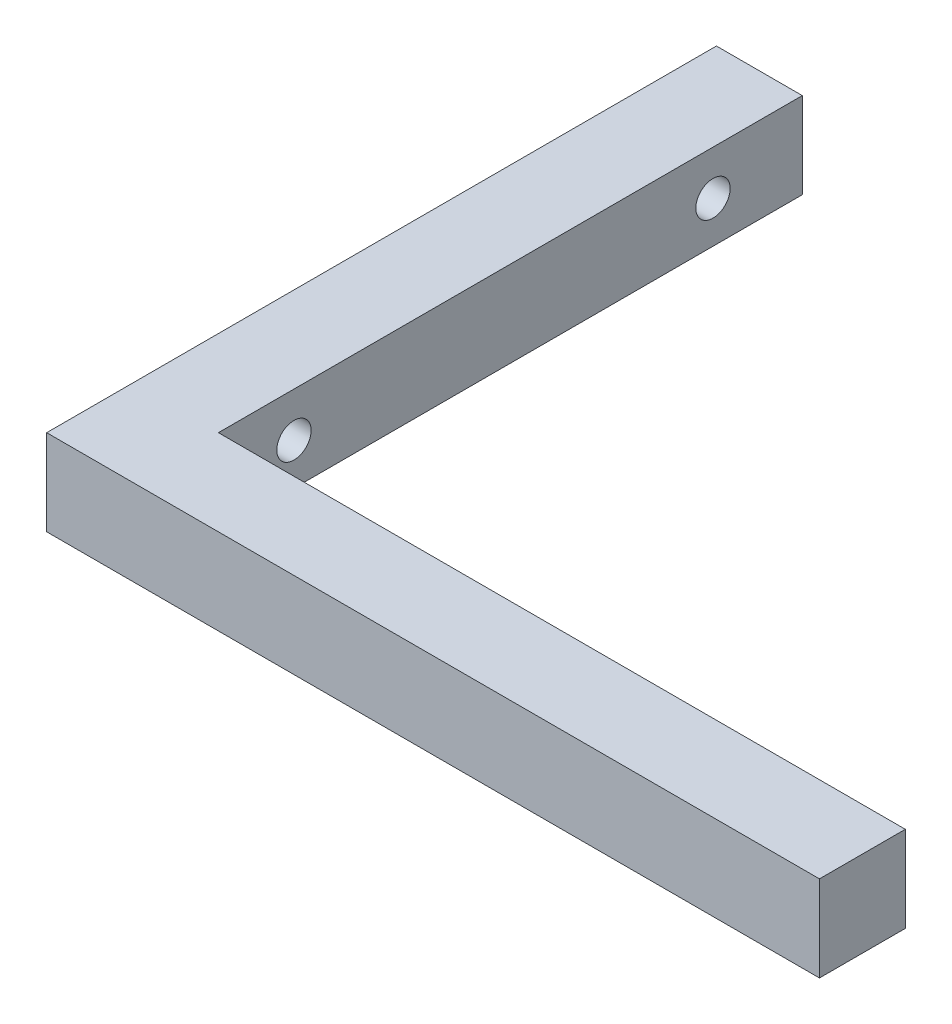
ISO-10303-21;
HEADER;
FILE_DESCRIPTION(('STEP AP214'),'2;1');
FILE_NAME('part.step','',(''),(''),'','','');
FILE_SCHEMA(('AUTOMOTIVE_DESIGN { 1 0 10303 214 1 1 1 1 }'));
ENDSEC;
DATA;
#1=APPLICATION_CONTEXT('core data for automotive mechanical design processes');
#2=APPLICATION_PROTOCOL_DEFINITION('international standard','automotive_design',2000,#1);
#3=PRODUCT_CONTEXT('',#1,'mechanical');
#4=PRODUCT('Part','Part','',(#3));
#5=PRODUCT_RELATED_PRODUCT_CATEGORY('part','',(#4));
#6=PRODUCT_DEFINITION_FORMATION('','',#4);
#7=PRODUCT_DEFINITION_CONTEXT('part definition',#1,'design');
#8=PRODUCT_DEFINITION('design','',#6,#7);
#9=PRODUCT_DEFINITION_SHAPE('','',#8);
#10=(LENGTH_UNIT() NAMED_UNIT(*) SI_UNIT(.MILLI.,.METRE.));
#11=(NAMED_UNIT(*) PLANE_ANGLE_UNIT() SI_UNIT($,.RADIAN.));
#12=(NAMED_UNIT(*) SI_UNIT($,.STERADIAN.) SOLID_ANGLE_UNIT());
#13=UNCERTAINTY_MEASURE_WITH_UNIT(LENGTH_MEASURE(1.E-05),#10,'distance_accuracy_value','');
#14=(GEOMETRIC_REPRESENTATION_CONTEXT(3) GLOBAL_UNCERTAINTY_ASSIGNED_CONTEXT((#13)) GLOBAL_UNIT_ASSIGNED_CONTEXT((#10,
#11,#12)) REPRESENTATION_CONTEXT('',''));
#15=CARTESIAN_POINT('',(0.,0.,0.));
#16=DIRECTION('',(0.,0.,1.));
#17=DIRECTION('',(1.,0.,0.));
#18=AXIS2_PLACEMENT_3D('',#15,#16,#17);
#19=CARTESIAN_POINT('',(0.,6.35,-6.35));
#20=DIRECTION('',(-1.,0.,0.));
#21=DIRECTION('',(0.,0.,1.));
#22=AXIS2_PLACEMENT_3D('',#19,#20,#21);
#23=PLANE('',#22);
#24=DIRECTION('',(0.,0.,-1.));
#25=VECTOR('',#24,1.);
#26=CARTESIAN_POINT('',(0.,0.,-6.35));
#27=LINE('',#26,#25);
#28=CARTESIAN_POINT('',(0.,0.,0.));
#29=VERTEX_POINT('',#28);
#30=CARTESIAN_POINT('',(0.,0.,-6.35));
#31=VERTEX_POINT('',#30);
#32=EDGE_CURVE('E127',#29,#31,#27,.T.);
#33=ORIENTED_EDGE('',*,*,#32,.T.);
#34=DIRECTION('',(0.,-1.,0.));
#35=VECTOR('',#34,1.);
#36=CARTESIAN_POINT('',(0.,6.35,-6.35));
#37=LINE('',#36,#35);
#38=CARTESIAN_POINT('',(0.,6.35,-6.35));
#39=VERTEX_POINT('',#38);
#40=EDGE_CURVE('E11',#39,#31,#37,.T.);
#41=ORIENTED_EDGE('',*,*,#40,.F.);
#42=DIRECTION('',(0.,0.,-1.));
#43=VECTOR('',#42,1.);
#44=CARTESIAN_POINT('',(0.,6.35,-6.35));
#45=LINE('',#44,#43);
#46=CARTESIAN_POINT('',(0.,6.35,0.));
#47=VERTEX_POINT('',#46);
#48=EDGE_CURVE('E138',#47,#39,#45,.T.);
#49=ORIENTED_EDGE('',*,*,#48,.F.);
#50=DIRECTION('',(0.,-1.,0.));
#51=VECTOR('',#50,1.);
#52=CARTESIAN_POINT('',(0.,6.35,0.));
#53=LINE('',#52,#51);
#54=EDGE_CURVE('E123',#47,#29,#53,.T.);
#55=ORIENTED_EDGE('',*,*,#54,.T.);
#56=EDGE_LOOP('',(#33,#41,#49,#55));
#57=FACE_BOUND('',#56,.T.);
#58=ADVANCED_FACE('F43',(#57),#23,.F.);
#59=CARTESIAN_POINT('',(-50.8,6.35,-6.35));
#60=DIRECTION('',(0.,0.,1.));
#61=DIRECTION('',(1.,0.,0.));
#62=AXIS2_PLACEMENT_3D('',#59,#60,#61);
#63=PLANE('',#62);
#64=DIRECTION('',(-1.,0.,0.));
#65=VECTOR('',#64,1.);
#66=CARTESIAN_POINT('',(-50.8,0.,-6.35));
#67=LINE('',#66,#65);
#68=CARTESIAN_POINT('',(-50.8,0.,-6.35));
#69=VERTEX_POINT('',#68);
#70=EDGE_CURVE('E130',#31,#69,#67,.T.);
#71=ORIENTED_EDGE('',*,*,#70,.T.);
#72=DIRECTION('',(0.,-1.,0.));
#73=VECTOR('',#72,1.);
#74=CARTESIAN_POINT('',(-50.8,6.35,-6.35));
#75=LINE('',#74,#73);
#76=CARTESIAN_POINT('',(-50.8,6.35,-6.35));
#77=VERTEX_POINT('',#76);
#78=EDGE_CURVE('E51',#77,#69,#75,.T.);
#79=ORIENTED_EDGE('',*,*,#78,.F.);
#80=DIRECTION('',(-1.,0.,0.));
#81=VECTOR('',#80,1.);
#82=CARTESIAN_POINT('',(-50.8,6.35,-6.35));
#83=LINE('',#82,#81);
#84=EDGE_CURVE('E96',#39,#77,#83,.T.);
#85=ORIENTED_EDGE('',*,*,#84,.F.);
#86=ORIENTED_EDGE('',*,*,#40,.T.);
#87=EDGE_LOOP('',(#71,#79,#85,#86));
#88=FACE_BOUND('',#87,.T.);
#89=ADVANCED_FACE('F164',(#88),#63,.F.);
#90=CARTESIAN_POINT('',(-50.8,6.35,-49.53));
#91=DIRECTION('',(-1.,0.,0.));
#92=DIRECTION('',(0.,0.,1.));
#93=AXIS2_PLACEMENT_3D('',#90,#91,#92);
#94=PLANE('',#93);
#95=CARTESIAN_POINT('',(-50.8,3.07272511679457,-42.926));
#96=DIRECTION('',(-1.,0.,0.));
#97=DIRECTION('',(0.,0.,1.));
#98=AXIS2_PLACEMENT_3D('',#95,#96,#97);
#99=CIRCLE('',#98,1.27);
#100=CARTESIAN_POINT('',(-50.8,3.07272511679457,-41.656));
#101=VERTEX_POINT('',#100);
#102=EDGE_CURVE('E131',#101,#101,#99,.T.);
#103=ORIENTED_EDGE('',*,*,#102,.T.);
#104=EDGE_LOOP('',(#103));
#105=FACE_BOUND('',#104,.T.);
#106=CARTESIAN_POINT('',(-50.8,3.07272511679457,-11.938));
#107=DIRECTION('',(-1.,0.,0.));
#108=DIRECTION('',(0.,0.,1.));
#109=AXIS2_PLACEMENT_3D('',#106,#107,#108);
#110=CIRCLE('',#109,1.27);
#111=CARTESIAN_POINT('',(-50.8,3.07272511679457,-10.668));
#112=VERTEX_POINT('',#111);
#113=EDGE_CURVE('E233',#112,#112,#110,.T.);
#114=ORIENTED_EDGE('',*,*,#113,.T.);
#115=EDGE_LOOP('',(#114));
#116=FACE_BOUND('',#115,.T.);
#117=DIRECTION('',(0.,0.,-1.));
#118=VECTOR('',#117,1.);
#119=CARTESIAN_POINT('',(-50.8,0.,-49.53));
#120=LINE('',#119,#118);
#121=CARTESIAN_POINT('',(-50.8,0.,-49.53));
#122=VERTEX_POINT('',#121);
#123=EDGE_CURVE('E133',#69,#122,#120,.T.);
#124=ORIENTED_EDGE('',*,*,#123,.T.);
#125=DIRECTION('',(0.,-1.,0.));
#126=VECTOR('',#125,1.);
#127=CARTESIAN_POINT('',(-50.8,6.35,-49.53));
#128=LINE('',#127,#126);
#129=CARTESIAN_POINT('',(-50.8,6.35,-49.53));
#130=VERTEX_POINT('',#129);
#131=EDGE_CURVE('E118',#130,#122,#128,.T.);
#132=ORIENTED_EDGE('',*,*,#131,.F.);
#133=DIRECTION('',(0.,0.,-1.));
#134=VECTOR('',#133,1.);
#135=CARTESIAN_POINT('',(-50.8,6.35,-49.53));
#136=LINE('',#135,#134);
#137=EDGE_CURVE('E109',#77,#130,#136,.T.);
#138=ORIENTED_EDGE('',*,*,#137,.F.);
#139=ORIENTED_EDGE('',*,*,#78,.T.);
#140=EDGE_LOOP('',(#124,#132,#138,#139));
#141=FACE_BOUND('',#140,.T.);
#142=ADVANCED_FACE('F144',(#105,#116,#141),#94,.F.);
#143=CARTESIAN_POINT('',(-57.15,6.35,-49.53));
#144=DIRECTION('',(0.,0.,1.));
#145=DIRECTION('',(1.,0.,0.));
#146=AXIS2_PLACEMENT_3D('',#143,#144,#145);
#147=PLANE('',#146);
#148=DIRECTION('',(-1.,0.,0.));
#149=VECTOR('',#148,1.);
#150=CARTESIAN_POINT('',(-57.15,0.,-49.53));
#151=LINE('',#150,#149);
#152=CARTESIAN_POINT('',(-57.15,0.,-49.53));
#153=VERTEX_POINT('',#152);
#154=EDGE_CURVE('E117',#122,#153,#151,.T.);
#155=ORIENTED_EDGE('',*,*,#154,.T.);
#156=DIRECTION('',(0.,-1.,0.));
#157=VECTOR('',#156,1.);
#158=CARTESIAN_POINT('',(-57.15,6.35,-49.53));
#159=LINE('',#158,#157);
#160=CARTESIAN_POINT('',(-57.15,6.35,-49.53));
#161=VERTEX_POINT('',#160);
#162=EDGE_CURVE('E114',#161,#153,#159,.T.);
#163=ORIENTED_EDGE('',*,*,#162,.F.);
#164=DIRECTION('',(-1.,0.,0.));
#165=VECTOR('',#164,1.);
#166=CARTESIAN_POINT('',(-57.15,6.35,-49.53));
#167=LINE('',#166,#165);
#168=EDGE_CURVE('E103',#130,#161,#167,.T.);
#169=ORIENTED_EDGE('',*,*,#168,.F.);
#170=ORIENTED_EDGE('',*,*,#131,.T.);
#171=EDGE_LOOP('',(#155,#163,#169,#170));
#172=FACE_BOUND('',#171,.T.);
#173=ADVANCED_FACE('F115',(#172),#147,.F.);
#174=CARTESIAN_POINT('',(-57.15,6.35,0.));
#175=DIRECTION('',(1.,0.,0.));
#176=DIRECTION('',(0.,0.,-1.));
#177=AXIS2_PLACEMENT_3D('',#174,#175,#176);
#178=PLANE('',#177);
#179=CARTESIAN_POINT('',(-57.15,3.07272511679457,-42.926));
#180=DIRECTION('',(-1.,0.,0.));
#181=DIRECTION('',(0.,0.,1.));
#182=AXIS2_PLACEMENT_3D('',#179,#180,#181);
#183=CIRCLE('',#182,1.27);
#184=CARTESIAN_POINT('',(-57.15,3.07272511679457,-41.656));
#185=VERTEX_POINT('',#184);
#186=EDGE_CURVE('E232',#185,#185,#183,.T.);
#187=ORIENTED_EDGE('',*,*,#186,.F.);
#188=EDGE_LOOP('',(#187));
#189=FACE_BOUND('',#188,.T.);
#190=CARTESIAN_POINT('',(-57.15,3.07272511679457,-11.938));
#191=DIRECTION('',(-1.,0.,0.));
#192=DIRECTION('',(0.,0.,1.));
#193=AXIS2_PLACEMENT_3D('',#190,#191,#192);
#194=CIRCLE('',#193,1.27);
#195=CARTESIAN_POINT('',(-57.15,3.07272511679457,-10.668));
#196=VERTEX_POINT('',#195);
#197=EDGE_CURVE('E237',#196,#196,#194,.T.);
#198=ORIENTED_EDGE('',*,*,#197,.F.);
#199=EDGE_LOOP('',(#198));
#200=FACE_BOUND('',#199,.T.);
#201=DIRECTION('',(0.,0.,1.));
#202=VECTOR('',#201,1.);
#203=CARTESIAN_POINT('',(-57.15,0.,0.));
#204=LINE('',#203,#202);
#205=CARTESIAN_POINT('',(-57.15,0.,0.));
#206=VERTEX_POINT('',#205);
#207=EDGE_CURVE('E82',#153,#206,#204,.T.);
#208=ORIENTED_EDGE('',*,*,#207,.T.);
#209=DIRECTION('',(0.,-1.,0.));
#210=VECTOR('',#209,1.);
#211=CARTESIAN_POINT('',(-57.15,6.35,0.));
#212=LINE('',#211,#210);
#213=CARTESIAN_POINT('',(-57.15,6.35,0.));
#214=VERTEX_POINT('',#213);
#215=EDGE_CURVE('E119',#214,#206,#212,.T.);
#216=ORIENTED_EDGE('',*,*,#215,.F.);
#217=DIRECTION('',(0.,0.,1.));
#218=VECTOR('',#217,1.);
#219=CARTESIAN_POINT('',(-57.15,6.35,0.));
#220=LINE('',#219,#218);
#221=EDGE_CURVE('E107',#161,#214,#220,.T.);
#222=ORIENTED_EDGE('',*,*,#221,.F.);
#223=ORIENTED_EDGE('',*,*,#162,.T.);
#224=EDGE_LOOP('',(#208,#216,#222,#223));
#225=FACE_BOUND('',#224,.T.);
#226=ADVANCED_FACE('F121',(#189,#200,#225),#178,.F.);
#227=CARTESIAN_POINT('',(0.,6.35,0.));
#228=DIRECTION('',(0.,0.,-1.));
#229=DIRECTION('',(-1.,0.,0.));
#230=AXIS2_PLACEMENT_3D('',#227,#228,#229);
#231=PLANE('',#230);
#232=DIRECTION('',(1.,0.,0.));
#233=VECTOR('',#232,1.);
#234=CARTESIAN_POINT('',(0.,0.,0.));
#235=LINE('',#234,#233);
#236=EDGE_CURVE('E88',#206,#29,#235,.T.);
#237=ORIENTED_EDGE('',*,*,#236,.T.);
#238=ORIENTED_EDGE('',*,*,#54,.F.);
#239=DIRECTION('',(1.,0.,0.));
#240=VECTOR('',#239,1.);
#241=CARTESIAN_POINT('',(0.,6.35,0.));
#242=LINE('',#241,#240);
#243=EDGE_CURVE('E59',#214,#47,#242,.T.);
#244=ORIENTED_EDGE('',*,*,#243,.F.);
#245=ORIENTED_EDGE('',*,*,#215,.T.);
#246=EDGE_LOOP('',(#237,#238,#244,#245));
#247=FACE_BOUND('',#246,.T.);
#248=ADVANCED_FACE('F151',(#247),#231,.F.);
#249=CARTESIAN_POINT('',(0.,6.35,0.));
#250=DIRECTION('',(0.,-1.,0.));
#251=DIRECTION('',(0.,0.,-1.));
#252=AXIS2_PLACEMENT_3D('',#249,#250,#251);
#253=PLANE('',#252);
#254=ORIENTED_EDGE('',*,*,#48,.T.);
#255=ORIENTED_EDGE('',*,*,#84,.T.);
#256=ORIENTED_EDGE('',*,*,#137,.T.);
#257=ORIENTED_EDGE('',*,*,#168,.T.);
#258=ORIENTED_EDGE('',*,*,#221,.T.);
#259=ORIENTED_EDGE('',*,*,#243,.T.);
#260=EDGE_LOOP('',(#254,#255,#256,#257,#258,#259));
#261=FACE_BOUND('',#260,.T.);
#262=ADVANCED_FACE('F105',(#261),#253,.F.);
#263=CARTESIAN_POINT('',(0.,0.,0.));
#264=DIRECTION('',(0.,-1.,0.));
#265=DIRECTION('',(0.,0.,-1.));
#266=AXIS2_PLACEMENT_3D('',#263,#264,#265);
#267=PLANE('',#266);
#268=ORIENTED_EDGE('',*,*,#32,.F.);
#269=ORIENTED_EDGE('',*,*,#236,.F.);
#270=ORIENTED_EDGE('',*,*,#207,.F.);
#271=ORIENTED_EDGE('',*,*,#154,.F.);
#272=ORIENTED_EDGE('',*,*,#123,.F.);
#273=ORIENTED_EDGE('',*,*,#70,.F.);
#274=EDGE_LOOP('',(#268,#269,#270,#271,#272,#273));
#275=FACE_BOUND('',#274,.T.);
#276=ADVANCED_FACE('F147',(#275),#267,.T.);
#277=CARTESIAN_POINT('',(-50.8,3.07272511679457,-11.938));
#278=DIRECTION('',(-1.,0.,0.));
#279=DIRECTION('',(0.,0.,1.));
#280=AXIS2_PLACEMENT_3D('',#277,#278,#279);
#281=CYLINDRICAL_SURFACE('',#280,1.27);
#282=ORIENTED_EDGE('',*,*,#113,.F.);
#283=EDGE_LOOP('',(#282));
#284=FACE_BOUND('',#283,.T.);
#285=ORIENTED_EDGE('',*,*,#197,.T.);
#286=EDGE_LOOP('',(#285));
#287=FACE_BOUND('',#286,.T.);
#288=ADVANCED_FACE('F207',(#284,#287),#281,.F.);
#289=CARTESIAN_POINT('',(-50.8,3.07272511679457,-42.926));
#290=DIRECTION('',(-1.,0.,0.));
#291=DIRECTION('',(0.,0.,1.));
#292=AXIS2_PLACEMENT_3D('',#289,#290,#291);
#293=CYLINDRICAL_SURFACE('',#292,1.27);
#294=ORIENTED_EDGE('',*,*,#102,.F.);
#295=EDGE_LOOP('',(#294));
#296=FACE_BOUND('',#295,.T.);
#297=ORIENTED_EDGE('',*,*,#186,.T.);
#298=EDGE_LOOP('',(#297));
#299=FACE_BOUND('',#298,.T.);
#300=ADVANCED_FACE('F214',(#296,#299),#293,.F.);
#301=CLOSED_SHELL('',(#58,#89,#142,#173,#226,#248,#262,#276,#288,#300));
#302=MANIFOLD_SOLID_BREP('B2',#301);
#303=ADVANCED_BREP_SHAPE_REPRESENTATION('',(#18,#302),#14);
#304=SHAPE_DEFINITION_REPRESENTATION(#9,#303);
ENDSEC;
END-ISO-10303-21;
